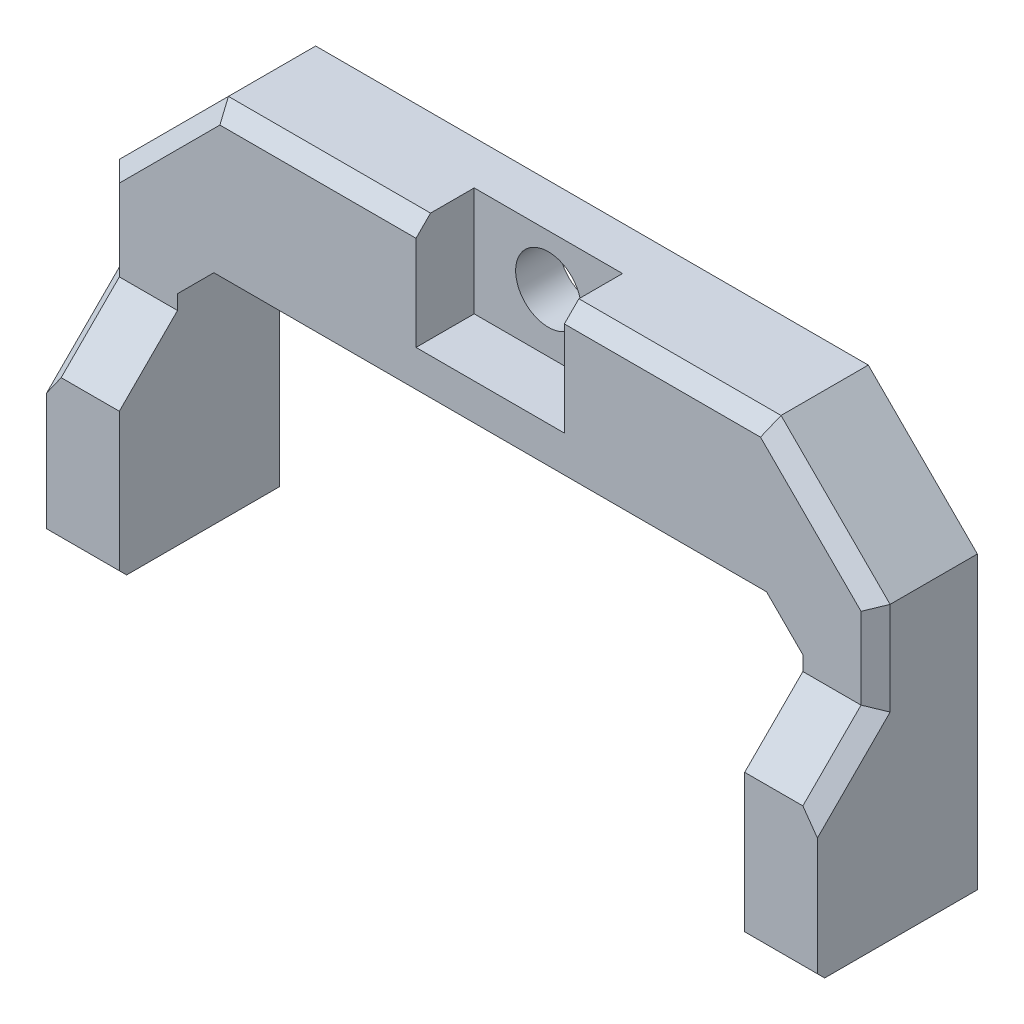
ISO-10303-21;
HEADER;
FILE_DESCRIPTION(('STEP AP214'),'2;1');
FILE_NAME('part.step','',(''),(''),'','','');
FILE_SCHEMA(('AUTOMOTIVE_DESIGN { 1 0 10303 214 1 1 1 1 }'));
ENDSEC;
DATA;
#1=APPLICATION_CONTEXT('core data for automotive mechanical design processes');
#2=APPLICATION_PROTOCOL_DEFINITION('international standard','automotive_design',2000,#1);
#3=PRODUCT_CONTEXT('',#1,'mechanical');
#4=PRODUCT('Part','Part','',(#3));
#5=PRODUCT_RELATED_PRODUCT_CATEGORY('part','',(#4));
#6=PRODUCT_DEFINITION_FORMATION('','',#4);
#7=PRODUCT_DEFINITION_CONTEXT('part definition',#1,'design');
#8=PRODUCT_DEFINITION('design','',#6,#7);
#9=PRODUCT_DEFINITION_SHAPE('','',#8);
#10=(LENGTH_UNIT() NAMED_UNIT(*) SI_UNIT(.MILLI.,.METRE.));
#11=(NAMED_UNIT(*) PLANE_ANGLE_UNIT() SI_UNIT($,.RADIAN.));
#12=(NAMED_UNIT(*) SI_UNIT($,.STERADIAN.) SOLID_ANGLE_UNIT());
#13=UNCERTAINTY_MEASURE_WITH_UNIT(LENGTH_MEASURE(1.E-05),#10,'distance_accuracy_value','');
#14=(GEOMETRIC_REPRESENTATION_CONTEXT(3) GLOBAL_UNCERTAINTY_ASSIGNED_CONTEXT((#13)) GLOBAL_UNIT_ASSIGNED_CONTEXT((#10,
#11,#12)) REPRESENTATION_CONTEXT('',''));
#15=CARTESIAN_POINT('',(0.,0.,0.));
#16=DIRECTION('',(0.,0.,1.));
#17=DIRECTION('',(1.,0.,0.));
#18=AXIS2_PLACEMENT_3D('',#15,#16,#17);
#19=CARTESIAN_POINT('',(-19.,0.,7.));
#20=DIRECTION('',(0.,-1.,0.));
#21=DIRECTION('',(0.,0.,-1.));
#22=AXIS2_PLACEMENT_3D('',#19,#20,#21);
#23=PLANE('',#22);
#24=DIRECTION('',(0.,0.,1.));
#25=VECTOR('',#24,1.);
#26=CARTESIAN_POINT('',(5.1,0.,3.));
#27=LINE('',#26,#25);
#28=CARTESIAN_POINT('',(5.1,0.,3.));
#29=VERTEX_POINT('',#28);
#30=CARTESIAN_POINT('',(5.1,0.,6.00000000000001));
#31=VERTEX_POINT('',#30);
#32=EDGE_CURVE('E239',#29,#31,#27,.T.);
#33=ORIENTED_EDGE('',*,*,#32,.T.);
#34=DIRECTION('',(1.,0.,0.));
#35=VECTOR('',#34,1.);
#36=CARTESIAN_POINT('',(19.,0.,6.00000000000001));
#37=LINE('',#36,#35);
#38=CARTESIAN_POINT('',(19.,0.,6.00000000000001));
#39=VERTEX_POINT('',#38);
#40=EDGE_CURVE('E442',#31,#39,#37,.T.);
#41=ORIENTED_EDGE('',*,*,#40,.T.);
#42=DIRECTION('',(0.,0.,-1.));
#43=VECTOR('',#42,1.);
#44=CARTESIAN_POINT('',(19.,0.,7.));
#45=LINE('',#44,#43);
#46=CARTESIAN_POINT('',(19.,0.,0.));
#47=VERTEX_POINT('',#46);
#48=EDGE_CURVE('E273',#39,#47,#45,.T.);
#49=ORIENTED_EDGE('',*,*,#48,.T.);
#50=DIRECTION('',(-1.,0.,0.));
#51=VECTOR('',#50,1.);
#52=CARTESIAN_POINT('',(-19.,0.,0.));
#53=LINE('',#52,#51);
#54=CARTESIAN_POINT('',(-19.,0.,0.));
#55=VERTEX_POINT('',#54);
#56=EDGE_CURVE('E351',#47,#55,#53,.T.);
#57=ORIENTED_EDGE('',*,*,#56,.T.);
#58=DIRECTION('',(0.,0.,-1.));
#59=VECTOR('',#58,1.);
#60=CARTESIAN_POINT('',(-19.,0.,7.));
#61=LINE('',#60,#59);
#62=CARTESIAN_POINT('',(-19.,0.,5.99999999999999));
#63=VERTEX_POINT('',#62);
#64=EDGE_CURVE('E388',#63,#55,#61,.T.);
#65=ORIENTED_EDGE('',*,*,#64,.F.);
#66=DIRECTION('',(1.,0.,0.));
#67=VECTOR('',#66,1.);
#68=CARTESIAN_POINT('',(-5.1,0.,5.99999999999999));
#69=LINE('',#68,#67);
#70=CARTESIAN_POINT('',(-5.1,0.,5.99999999999999));
#71=VERTEX_POINT('',#70);
#72=EDGE_CURVE('E439',#63,#71,#69,.T.);
#73=ORIENTED_EDGE('',*,*,#72,.T.);
#74=DIRECTION('',(0.,0.,1.));
#75=VECTOR('',#74,1.);
#76=CARTESIAN_POINT('',(-5.1,0.,3.));
#77=LINE('',#76,#75);
#78=CARTESIAN_POINT('',(-5.1,0.,3.));
#79=VERTEX_POINT('',#78);
#80=EDGE_CURVE('E230',#79,#71,#77,.T.);
#81=ORIENTED_EDGE('',*,*,#80,.F.);
#82=DIRECTION('',(-1.,0.,0.));
#83=VECTOR('',#82,1.);
#84=CARTESIAN_POINT('',(0.,0.,3.));
#85=LINE('',#84,#83);
#86=EDGE_CURVE('E311',#29,#79,#85,.T.);
#87=ORIENTED_EDGE('',*,*,#86,.F.);
#88=EDGE_LOOP('',(#33,#41,#49,#57,#65,#73,#81,#87));
#89=FACE_BOUND('',#88,.T.);
#90=ADVANCED_FACE('F40',(#89),#23,.F.);
#91=CARTESIAN_POINT('',(0.,0.,7.));
#92=DIRECTION('',(0.,0.,1.));
#93=DIRECTION('',(1.,0.,0.));
#94=AXIS2_PLACEMENT_3D('',#91,#92,#93);
#95=PLANE('',#94);
#96=DIRECTION('',(1.,0.,0.));
#97=VECTOR('',#96,1.);
#98=CARTESIAN_POINT('',(26.5,-13.5,7.));
#99=LINE('',#98,#97);
#100=CARTESIAN_POINT('',(21.5,-13.5,7.));
#101=VERTEX_POINT('',#100);
#102=CARTESIAN_POINT('',(25.5,-13.5,7.));
#103=VERTEX_POINT('',#102);
#104=EDGE_CURVE('E394',#101,#103,#99,.T.);
#105=ORIENTED_EDGE('',*,*,#104,.T.);
#106=DIRECTION('',(0.,1.,0.));
#107=VECTOR('',#106,1.);
#108=CARTESIAN_POINT('',(25.5,0.,7.));
#109=LINE('',#108,#107);
#110=CARTESIAN_POINT('',(25.5,-7.91421356237307,7.));
#111=VERTEX_POINT('',#110);
#112=EDGE_CURVE('E433',#103,#111,#109,.T.);
#113=ORIENTED_EDGE('',*,*,#112,.T.);
#114=DIRECTION('',(-0.707106781186549,0.707106781186546,0.));
#115=VECTOR('',#114,1.);
#116=CARTESIAN_POINT('',(8.79289321881342,8.79289321881345,7.));
#117=LINE('',#116,#115);
#118=CARTESIAN_POINT('',(18.5857864376269,-0.999999999999994,7.));
#119=VERTEX_POINT('',#118);
#120=EDGE_CURVE('E430',#111,#119,#117,.T.);
#121=ORIENTED_EDGE('',*,*,#120,.T.);
#122=DIRECTION('',(-1.,0.,0.));
#123=VECTOR('',#122,1.);
#124=CARTESIAN_POINT('',(5.1,-0.999999999999994,7.));
#125=LINE('',#124,#123);
#126=CARTESIAN_POINT('',(5.1,-0.999999999999994,7.));
#127=VERTEX_POINT('',#126);
#128=EDGE_CURVE('E427',#119,#127,#125,.T.);
#129=ORIENTED_EDGE('',*,*,#128,.T.);
#130=DIRECTION('',(0.,-1.,0.));
#131=VECTOR('',#130,1.);
#132=CARTESIAN_POINT('',(5.1,0.,7.));
#133=LINE('',#132,#131);
#134=CARTESIAN_POINT('',(5.1,-7.5,7.));
#135=VERTEX_POINT('',#134);
#136=EDGE_CURVE('E241',#127,#135,#133,.T.);
#137=ORIENTED_EDGE('',*,*,#136,.T.);
#138=DIRECTION('',(1.,0.,0.));
#139=VECTOR('',#138,1.);
#140=CARTESIAN_POINT('',(0.,-7.5,7.));
#141=LINE('',#140,#139);
#142=CARTESIAN_POINT('',(-5.1,-7.5,7.));
#143=VERTEX_POINT('',#142);
#144=EDGE_CURVE('E246',#143,#135,#141,.T.);
#145=ORIENTED_EDGE('',*,*,#144,.F.);
#146=DIRECTION('',(0.,-1.,0.));
#147=VECTOR('',#146,1.);
#148=CARTESIAN_POINT('',(-5.1,0.,7.));
#149=LINE('',#148,#147);
#150=CARTESIAN_POINT('',(-5.1,-1.00000000000001,7.));
#151=VERTEX_POINT('',#150);
#152=EDGE_CURVE('E310',#151,#143,#149,.T.);
#153=ORIENTED_EDGE('',*,*,#152,.F.);
#154=DIRECTION('',(-1.,0.,0.));
#155=VECTOR('',#154,1.);
#156=CARTESIAN_POINT('',(-19.,-1.00000000000001,7.));
#157=LINE('',#156,#155);
#158=CARTESIAN_POINT('',(-18.5857864376269,-1.00000000000001,7.));
#159=VERTEX_POINT('',#158);
#160=EDGE_CURVE('E418',#151,#159,#157,.T.);
#161=ORIENTED_EDGE('',*,*,#160,.T.);
#162=DIRECTION('',(-0.707106781186548,-0.707106781186547,0.));
#163=VECTOR('',#162,1.);
#164=CARTESIAN_POINT('',(-25.7928932188134,-8.20710678118654,7.));
#165=LINE('',#164,#163);
#166=CARTESIAN_POINT('',(-25.5,-7.91421356237308,7.));
#167=VERTEX_POINT('',#166);
#168=EDGE_CURVE('E421',#159,#167,#165,.T.);
#169=ORIENTED_EDGE('',*,*,#168,.T.);
#170=DIRECTION('',(0.,-1.,0.));
#171=VECTOR('',#170,1.);
#172=CARTESIAN_POINT('',(-25.5,-13.5,7.));
#173=LINE('',#172,#171);
#174=CARTESIAN_POINT('',(-25.5,-13.5,7.));
#175=VERTEX_POINT('',#174);
#176=EDGE_CURVE('E424',#167,#175,#173,.T.);
#177=ORIENTED_EDGE('',*,*,#176,.T.);
#178=DIRECTION('',(1.,0.,0.));
#179=VECTOR('',#178,1.);
#180=CARTESIAN_POINT('',(0.,-13.5,7.));
#181=LINE('',#180,#179);
#182=CARTESIAN_POINT('',(-21.5,-13.5,7.));
#183=VERTEX_POINT('',#182);
#184=EDGE_CURVE('E391',#175,#183,#181,.T.);
#185=ORIENTED_EDGE('',*,*,#184,.T.);
#186=DIRECTION('',(0.,1.,0.));
#187=VECTOR('',#186,1.);
#188=CARTESIAN_POINT('',(-21.5,-12.5,7.));
#189=LINE('',#188,#187);
#190=CARTESIAN_POINT('',(-21.5,-12.5,7.));
#191=VERTEX_POINT('',#190);
#192=EDGE_CURVE('E341',#183,#191,#189,.T.);
#193=ORIENTED_EDGE('',*,*,#192,.T.);
#194=DIRECTION('',(0.707106781186549,0.707106781186547,0.));
#195=VECTOR('',#194,1.);
#196=CARTESIAN_POINT('',(-19.,-10.,7.));
#197=LINE('',#196,#195);
#198=CARTESIAN_POINT('',(-19.,-10.,7.));
#199=VERTEX_POINT('',#198);
#200=EDGE_CURVE('E345',#191,#199,#197,.T.);
#201=ORIENTED_EDGE('',*,*,#200,.T.);
#202=DIRECTION('',(1.,0.,0.));
#203=VECTOR('',#202,1.);
#204=CARTESIAN_POINT('',(0.,-10.,7.));
#205=LINE('',#204,#203);
#206=CARTESIAN_POINT('',(19.,-10.,7.));
#207=VERTEX_POINT('',#206);
#208=EDGE_CURVE('E338',#199,#207,#205,.T.);
#209=ORIENTED_EDGE('',*,*,#208,.T.);
#210=DIRECTION('',(-0.707106781186549,0.707106781186546,0.));
#211=VECTOR('',#210,1.);
#212=CARTESIAN_POINT('',(19.,-10.,7.));
#213=LINE('',#212,#211);
#214=CARTESIAN_POINT('',(21.5,-12.5,7.));
#215=VERTEX_POINT('',#214);
#216=EDGE_CURVE('E265',#215,#207,#213,.T.);
#217=ORIENTED_EDGE('',*,*,#216,.F.);
#218=DIRECTION('',(0.,1.,0.));
#219=VECTOR('',#218,1.);
#220=CARTESIAN_POINT('',(21.5,-12.5,7.));
#221=LINE('',#220,#219);
#222=EDGE_CURVE('E269',#101,#215,#221,.T.);
#223=ORIENTED_EDGE('',*,*,#222,.F.);
#224=EDGE_LOOP('',(#105,#113,#121,#129,#137,#145,#153,#161,#169,#177,#185,#193,#201,#209,#217,#223));
#225=FACE_BOUND('',#224,.T.);
#226=ADVANCED_FACE('F541',(#225),#95,.T.);
#227=CARTESIAN_POINT('',(0.,-10.,7.));
#228=DIRECTION('',(0.,1.,0.));
#229=DIRECTION('',(-1.,0.,0.));
#230=AXIS2_PLACEMENT_3D('',#227,#228,#229);
#231=PLANE('',#230);
#232=DIRECTION('',(1.,0.,0.));
#233=VECTOR('',#232,1.);
#234=CARTESIAN_POINT('',(0.,-10.,0.));
#235=LINE('',#234,#233);
#236=CARTESIAN_POINT('',(-19.,-10.,0.));
#237=VERTEX_POINT('',#236);
#238=CARTESIAN_POINT('',(19.,-10.,0.));
#239=VERTEX_POINT('',#238);
#240=EDGE_CURVE('E337',#237,#239,#235,.T.);
#241=ORIENTED_EDGE('',*,*,#240,.T.);
#242=DIRECTION('',(0.,0.,-1.));
#243=VECTOR('',#242,1.);
#244=CARTESIAN_POINT('',(19.,-10.,7.));
#245=LINE('',#244,#243);
#246=EDGE_CURVE('E306',#207,#239,#245,.T.);
#247=ORIENTED_EDGE('',*,*,#246,.F.);
#248=ORIENTED_EDGE('',*,*,#208,.F.);
#249=DIRECTION('',(0.,0.,-1.));
#250=VECTOR('',#249,1.);
#251=CARTESIAN_POINT('',(-19.,-10.,7.));
#252=LINE('',#251,#250);
#253=EDGE_CURVE('E348',#199,#237,#252,.T.);
#254=ORIENTED_EDGE('',*,*,#253,.T.);
#255=EDGE_LOOP('',(#241,#247,#248,#254));
#256=FACE_BOUND('',#255,.T.);
#257=ADVANCED_FACE('F547',(#256),#231,.F.);
#258=CARTESIAN_POINT('',(-26.5,-7.49999999999999,7.));
#259=DIRECTION('',(0.707106781186547,-0.707106781186548,0.));
#260=DIRECTION('',(0.707106781186548,0.707106781186547,0.));
#261=AXIS2_PLACEMENT_3D('',#258,#259,#260);
#262=PLANE('',#261);
#263=DIRECTION('',(0.,0.,-1.));
#264=VECTOR('',#263,1.);
#265=CARTESIAN_POINT('',(-26.5,-7.49999999999999,7.));
#266=LINE('',#265,#264);
#267=CARTESIAN_POINT('',(-26.5,-7.49999999999999,5.99999999999999));
#268=VERTEX_POINT('',#267);
#269=CARTESIAN_POINT('',(-26.5,-7.49999999999999,0.));
#270=VERTEX_POINT('',#269);
#271=EDGE_CURVE('E385',#268,#270,#266,.T.);
#272=ORIENTED_EDGE('',*,*,#271,.F.);
#273=DIRECTION('',(0.707106781186548,0.707106781186547,0.));
#274=VECTOR('',#273,1.);
#275=CARTESIAN_POINT('',(-19.,0.,5.99999999999999));
#276=LINE('',#275,#274);
#277=EDGE_CURVE('E461',#268,#63,#276,.T.);
#278=ORIENTED_EDGE('',*,*,#277,.T.);
#279=ORIENTED_EDGE('',*,*,#64,.T.);
#280=DIRECTION('',(-0.707106781186548,-0.707106781186547,0.));
#281=VECTOR('',#280,1.);
#282=CARTESIAN_POINT('',(-26.5,-7.49999999999999,0.));
#283=LINE('',#282,#281);
#284=EDGE_CURVE('E355',#55,#270,#283,.T.);
#285=ORIENTED_EDGE('',*,*,#284,.T.);
#286=EDGE_LOOP('',(#272,#278,#279,#285));
#287=FACE_BOUND('',#286,.T.);
#288=ADVANCED_FACE('F552',(#287),#262,.F.);
#289=CARTESIAN_POINT('',(-26.5,-27.5,7.));
#290=DIRECTION('',(1.,0.,0.));
#291=DIRECTION('',(0.,0.,-1.));
#292=AXIS2_PLACEMENT_3D('',#289,#290,#291);
#293=PLANE('',#292);
#294=DIRECTION('',(0.,0.,-1.));
#295=VECTOR('',#294,1.);
#296=CARTESIAN_POINT('',(-26.5,-27.5,7.));
#297=LINE('',#296,#295);
#298=CARTESIAN_POINT('',(-26.5,-27.5,10.5));
#299=VERTEX_POINT('',#298);
#300=CARTESIAN_POINT('',(-26.5,-27.5,0.));
#301=VERTEX_POINT('',#300);
#302=EDGE_CURVE('E382',#299,#301,#297,.T.);
#303=ORIENTED_EDGE('',*,*,#302,.F.);
#304=DIRECTION('',(0.,-0.707106781186543,-0.707106781186552));
#305=VECTOR('',#304,1.);
#306=CARTESIAN_POINT('',(-26.5,-27.,11.));
#307=LINE('',#306,#305);
#308=CARTESIAN_POINT('',(-26.5,-27.,11.));
#309=VERTEX_POINT('',#308);
#310=EDGE_CURVE('E11',#299,#309,#307,.F.);
#311=ORIENTED_EDGE('',*,*,#310,.T.);
#312=DIRECTION('',(0.,-1.,0.));
#313=VECTOR('',#312,1.);
#314=CARTESIAN_POINT('',(-26.5,-27.5,11.));
#315=LINE('',#314,#313);
#316=CARTESIAN_POINT('',(-26.5,-18.9142135623731,11.));
#317=VERTEX_POINT('',#316);
#318=EDGE_CURVE('E323',#317,#309,#315,.T.);
#319=ORIENTED_EDGE('',*,*,#318,.F.);
#320=DIRECTION('',(0.,0.707106781186547,-0.707106781186548));
#321=VECTOR('',#320,1.);
#322=CARTESIAN_POINT('',(-26.5,-21.2071067811865,13.2928932188134));
#323=LINE('',#322,#321);
#324=CARTESIAN_POINT('',(-26.5,-13.9142135623731,5.99999999999999));
#325=VERTEX_POINT('',#324);
#326=EDGE_CURVE('E451',#317,#325,#323,.T.);
#327=ORIENTED_EDGE('',*,*,#326,.T.);
#328=DIRECTION('',(0.,1.,0.));
#329=VECTOR('',#328,1.);
#330=CARTESIAN_POINT('',(-26.5,-7.49999999999999,5.99999999999999));
#331=LINE('',#330,#329);
#332=EDGE_CURVE('E448',#325,#268,#331,.T.);
#333=ORIENTED_EDGE('',*,*,#332,.T.);
#334=ORIENTED_EDGE('',*,*,#271,.T.);
#335=DIRECTION('',(0.,-1.,0.));
#336=VECTOR('',#335,1.);
#337=CARTESIAN_POINT('',(-26.5,-27.5,0.));
#338=LINE('',#337,#336);
#339=EDGE_CURVE('E359',#270,#301,#338,.T.);
#340=ORIENTED_EDGE('',*,*,#339,.T.);
#341=EDGE_LOOP('',(#303,#311,#319,#327,#333,#334,#340));
#342=FACE_BOUND('',#341,.T.);
#343=ADVANCED_FACE('F532',(#342),#293,.F.);
#344=CARTESIAN_POINT('',(-21.5,-27.5,7.));
#345=DIRECTION('',(0.,1.,0.));
#346=DIRECTION('',(-1.,0.,0.));
#347=AXIS2_PLACEMENT_3D('',#344,#345,#346);
#348=PLANE('',#347);
#349=DIRECTION('',(0.,0.,-1.));
#350=VECTOR('',#349,1.);
#351=CARTESIAN_POINT('',(-21.5,-27.5,7.));
#352=LINE('',#351,#350);
#353=CARTESIAN_POINT('',(-21.5,-27.5,10.5));
#354=VERTEX_POINT('',#353);
#355=CARTESIAN_POINT('',(-21.5,-27.5,0.));
#356=VERTEX_POINT('',#355);
#357=EDGE_CURVE('E379',#354,#356,#352,.T.);
#358=ORIENTED_EDGE('',*,*,#357,.F.);
#359=DIRECTION('',(-1.,0.,0.));
#360=VECTOR('',#359,1.);
#361=CARTESIAN_POINT('',(-21.5,-27.5,10.5));
#362=LINE('',#361,#360);
#363=EDGE_CURVE('E50',#354,#299,#362,.T.);
#364=ORIENTED_EDGE('',*,*,#363,.T.);
#365=ORIENTED_EDGE('',*,*,#302,.T.);
#366=DIRECTION('',(1.,0.,0.));
#367=VECTOR('',#366,1.);
#368=CARTESIAN_POINT('',(-21.5,-27.5,0.));
#369=LINE('',#368,#367);
#370=EDGE_CURVE('E363',#301,#356,#369,.T.);
#371=ORIENTED_EDGE('',*,*,#370,.T.);
#372=EDGE_LOOP('',(#358,#364,#365,#371));
#373=FACE_BOUND('',#372,.T.);
#374=ADVANCED_FACE('F678',(#373),#348,.F.);
#375=CARTESIAN_POINT('',(-21.5,-12.5,7.));
#376=DIRECTION('',(-1.,0.,0.));
#377=DIRECTION('',(0.,-1.,0.));
#378=AXIS2_PLACEMENT_3D('',#375,#376,#377);
#379=PLANE('',#378);
#380=DIRECTION('',(0.,1.,0.));
#381=VECTOR('',#380,1.);
#382=CARTESIAN_POINT('',(-21.5,-27.5,11.));
#383=LINE('',#382,#381);
#384=CARTESIAN_POINT('',(-21.5,-27.,11.));
#385=VERTEX_POINT('',#384);
#386=CARTESIAN_POINT('',(-21.5,-17.5,11.));
#387=VERTEX_POINT('',#386);
#388=EDGE_CURVE('E330',#385,#387,#383,.T.);
#389=ORIENTED_EDGE('',*,*,#388,.F.);
#390=DIRECTION('',(0.,0.707106781186543,0.707106781186552));
#391=VECTOR('',#390,1.);
#392=CARTESIAN_POINT('',(-21.5,-27.,11.));
#393=LINE('',#392,#391);
#394=EDGE_CURVE('E64',#385,#354,#393,.F.);
#395=ORIENTED_EDGE('',*,*,#394,.T.);
#396=ORIENTED_EDGE('',*,*,#357,.T.);
#397=DIRECTION('',(0.,1.,0.));
#398=VECTOR('',#397,1.);
#399=CARTESIAN_POINT('',(-21.5,-12.5,0.));
#400=LINE('',#399,#398);
#401=CARTESIAN_POINT('',(-21.5,-12.5,0.));
#402=VERTEX_POINT('',#401);
#403=EDGE_CURVE('E367',#356,#402,#400,.T.);
#404=ORIENTED_EDGE('',*,*,#403,.T.);
#405=DIRECTION('',(0.,0.,-1.));
#406=VECTOR('',#405,1.);
#407=CARTESIAN_POINT('',(-21.5,-12.5,7.));
#408=LINE('',#407,#406);
#409=EDGE_CURVE('E375',#191,#402,#408,.T.);
#410=ORIENTED_EDGE('',*,*,#409,.F.);
#411=ORIENTED_EDGE('',*,*,#192,.F.);
#412=DIRECTION('',(0.,-0.707106781186547,0.707106781186548));
#413=VECTOR('',#412,1.);
#414=CARTESIAN_POINT('',(-21.5,-13.,6.5));
#415=LINE('',#414,#413);
#416=EDGE_CURVE('E401',#183,#387,#415,.T.);
#417=ORIENTED_EDGE('',*,*,#416,.T.);
#418=EDGE_LOOP('',(#389,#395,#396,#404,#410,#411,#417));
#419=FACE_BOUND('',#418,.T.);
#420=ADVANCED_FACE('F516',(#419),#379,.F.);
#421=CARTESIAN_POINT('',(-19.,-10.,7.));
#422=DIRECTION('',(-0.707106781186546,0.707106781186548,0.));
#423=DIRECTION('',(-0.707106781186549,-0.707106781186547,0.));
#424=AXIS2_PLACEMENT_3D('',#421,#422,#423);
#425=PLANE('',#424);
#426=DIRECTION('',(0.707106781186549,0.707106781186547,0.));
#427=VECTOR('',#426,1.);
#428=CARTESIAN_POINT('',(-19.,-10.,0.));
#429=LINE('',#428,#427);
#430=EDGE_CURVE('E342',#402,#237,#429,.T.);
#431=ORIENTED_EDGE('',*,*,#430,.T.);
#432=ORIENTED_EDGE('',*,*,#253,.F.);
#433=ORIENTED_EDGE('',*,*,#200,.F.);
#434=ORIENTED_EDGE('',*,*,#409,.T.);
#435=EDGE_LOOP('',(#431,#432,#433,#434));
#436=FACE_BOUND('',#435,.T.);
#437=ADVANCED_FACE('F671',(#436),#425,.F.);
#438=CARTESIAN_POINT('',(0.,0.,0.));
#439=DIRECTION('',(0.,0.,1.));
#440=DIRECTION('',(1.,0.,0.));
#441=AXIS2_PLACEMENT_3D('',#438,#439,#440);
#442=PLANE('',#441);
#443=CARTESIAN_POINT('',(0.,-3.5,0.));
#444=DIRECTION('',(0.,0.,1.));
#445=DIRECTION('',(1.,0.,0.));
#446=AXIS2_PLACEMENT_3D('',#443,#444,#445);
#447=CIRCLE('',#446,2.25);
#448=CARTESIAN_POINT('',(2.25,-3.5,0.));
#449=VERTEX_POINT('',#448);
#450=EDGE_CURVE('E641',#449,#449,#447,.T.);
#451=ORIENTED_EDGE('',*,*,#450,.T.);
#452=EDGE_LOOP('',(#451));
#453=FACE_BOUND('',#452,.T.);
#454=ORIENTED_EDGE('',*,*,#240,.F.);
#455=ORIENTED_EDGE('',*,*,#430,.F.);
#456=ORIENTED_EDGE('',*,*,#403,.F.);
#457=ORIENTED_EDGE('',*,*,#370,.F.);
#458=ORIENTED_EDGE('',*,*,#339,.F.);
#459=ORIENTED_EDGE('',*,*,#284,.F.);
#460=ORIENTED_EDGE('',*,*,#56,.F.);
#461=DIRECTION('',(0.707106781186549,-0.707106781186546,0.));
#462=VECTOR('',#461,1.);
#463=CARTESIAN_POINT('',(26.5,-7.49999999999998,0.));
#464=LINE('',#463,#462);
#465=CARTESIAN_POINT('',(26.5,-7.49999999999998,0.));
#466=VERTEX_POINT('',#465);
#467=EDGE_CURVE('E270',#47,#466,#464,.T.);
#468=ORIENTED_EDGE('',*,*,#467,.T.);
#469=DIRECTION('',(0.,-1.,0.));
#470=VECTOR('',#469,1.);
#471=CARTESIAN_POINT('',(26.5,-27.5,0.));
#472=LINE('',#471,#470);
#473=CARTESIAN_POINT('',(26.5,-27.5,0.));
#474=VERTEX_POINT('',#473);
#475=EDGE_CURVE('E285',#466,#474,#472,.T.);
#476=ORIENTED_EDGE('',*,*,#475,.T.);
#477=DIRECTION('',(-1.,0.,0.));
#478=VECTOR('',#477,1.);
#479=CARTESIAN_POINT('',(21.5,-27.5,0.));
#480=LINE('',#479,#478);
#481=CARTESIAN_POINT('',(21.5,-27.5,0.));
#482=VERTEX_POINT('',#481);
#483=EDGE_CURVE('E281',#474,#482,#480,.T.);
#484=ORIENTED_EDGE('',*,*,#483,.T.);
#485=DIRECTION('',(0.,1.,0.));
#486=VECTOR('',#485,1.);
#487=CARTESIAN_POINT('',(21.5,-12.5,0.));
#488=LINE('',#487,#486);
#489=CARTESIAN_POINT('',(21.5,-12.5,0.));
#490=VERTEX_POINT('',#489);
#491=EDGE_CURVE('E277',#482,#490,#488,.T.);
#492=ORIENTED_EDGE('',*,*,#491,.T.);
#493=DIRECTION('',(-0.707106781186549,0.707106781186546,0.));
#494=VECTOR('',#493,1.);
#495=CARTESIAN_POINT('',(19.,-10.,0.));
#496=LINE('',#495,#494);
#497=EDGE_CURVE('E264',#490,#239,#496,.T.);
#498=ORIENTED_EDGE('',*,*,#497,.T.);
#499=EDGE_LOOP('',(#454,#455,#456,#457,#458,#459,#460,#468,#476,#484,#492,#498));
#500=FACE_BOUND('',#499,.T.);
#501=ADVANCED_FACE('F667',(#453,#500),#442,.F.);
#502=CARTESIAN_POINT('',(0.,0.,11.));
#503=DIRECTION('',(0.,0.,-1.));
#504=DIRECTION('',(-1.,0.,0.));
#505=AXIS2_PLACEMENT_3D('',#502,#503,#504);
#506=PLANE('',#505);
#507=ORIENTED_EDGE('',*,*,#318,.T.);
#508=DIRECTION('',(1.,0.,0.));
#509=VECTOR('',#508,1.);
#510=CARTESIAN_POINT('',(0.,-27.,11.));
#511=LINE('',#510,#509);
#512=EDGE_CURVE('E504',#309,#385,#511,.T.);
#513=ORIENTED_EDGE('',*,*,#512,.T.);
#514=ORIENTED_EDGE('',*,*,#388,.T.);
#515=DIRECTION('',(-1.,0.,0.));
#516=VECTOR('',#515,1.);
#517=CARTESIAN_POINT('',(-26.5,-17.5,11.));
#518=LINE('',#517,#516);
#519=CARTESIAN_POINT('',(-25.5,-17.5,11.));
#520=VERTEX_POINT('',#519);
#521=EDGE_CURVE('E333',#387,#520,#518,.T.);
#522=ORIENTED_EDGE('',*,*,#521,.T.);
#523=DIRECTION('',(0.577350269189628,0.816496580927725,0.));
#524=VECTOR('',#523,1.);
#525=CARTESIAN_POINT('',(-27.5808802290397,-20.4428090415821,11.));
#526=LINE('',#525,#524);
#527=EDGE_CURVE('E458',#520,#317,#526,.F.);
#528=ORIENTED_EDGE('',*,*,#527,.T.);
#529=EDGE_LOOP('',(#507,#513,#514,#522,#528));
#530=FACE_BOUND('',#529,.T.);
#531=ADVANCED_FACE('F512',(#530),#506,.F.);
#532=CARTESIAN_POINT('',(0.,-7.5,3.));
#533=DIRECTION('',(0.,-1.,0.));
#534=DIRECTION('',(1.,0.,0.));
#535=AXIS2_PLACEMENT_3D('',#532,#533,#534);
#536=PLANE('',#535);
#537=ORIENTED_EDGE('',*,*,#144,.T.);
#538=DIRECTION('',(0.,0.,1.));
#539=VECTOR('',#538,1.);
#540=CARTESIAN_POINT('',(5.1,-7.5,3.));
#541=LINE('',#540,#539);
#542=CARTESIAN_POINT('',(5.1,-7.5,3.));
#543=VERTEX_POINT('',#542);
#544=EDGE_CURVE('E237',#543,#135,#541,.T.);
#545=ORIENTED_EDGE('',*,*,#544,.F.);
#546=DIRECTION('',(1.,0.,0.));
#547=VECTOR('',#546,1.);
#548=CARTESIAN_POINT('',(0.,-7.5,3.));
#549=LINE('',#548,#547);
#550=CARTESIAN_POINT('',(-5.1,-7.5,3.));
#551=VERTEX_POINT('',#550);
#552=EDGE_CURVE('E220',#551,#543,#549,.T.);
#553=ORIENTED_EDGE('',*,*,#552,.F.);
#554=DIRECTION('',(0.,0.,1.));
#555=VECTOR('',#554,1.);
#556=CARTESIAN_POINT('',(-5.1,-7.5,3.));
#557=LINE('',#556,#555);
#558=EDGE_CURVE('E320',#551,#143,#557,.T.);
#559=ORIENTED_EDGE('',*,*,#558,.T.);
#560=EDGE_LOOP('',(#537,#545,#553,#559));
#561=FACE_BOUND('',#560,.T.);
#562=ADVANCED_FACE('F244',(#561),#536,.F.);
#563=CARTESIAN_POINT('',(-5.1,0.,3.));
#564=DIRECTION('',(-1.,0.,0.));
#565=DIRECTION('',(0.,-1.,0.));
#566=AXIS2_PLACEMENT_3D('',#563,#564,#565);
#567=PLANE('',#566);
#568=ORIENTED_EDGE('',*,*,#80,.T.);
#569=DIRECTION('',(0.,-0.707106781186545,0.70710678118655));
#570=VECTOR('',#569,1.);
#571=CARTESIAN_POINT('',(-5.1,-1.00000000000001,7.));
#572=LINE('',#571,#570);
#573=EDGE_CURVE('E464',#71,#151,#572,.T.);
#574=ORIENTED_EDGE('',*,*,#573,.T.);
#575=ORIENTED_EDGE('',*,*,#152,.T.);
#576=ORIENTED_EDGE('',*,*,#558,.F.);
#577=DIRECTION('',(0.,-1.,0.));
#578=VECTOR('',#577,1.);
#579=CARTESIAN_POINT('',(-5.1,0.,3.));
#580=LINE('',#579,#578);
#581=EDGE_CURVE('E225',#79,#551,#580,.T.);
#582=ORIENTED_EDGE('',*,*,#581,.F.);
#583=EDGE_LOOP('',(#568,#574,#575,#576,#582));
#584=FACE_BOUND('',#583,.T.);
#585=ADVANCED_FACE('F636',(#584),#567,.F.);
#586=CARTESIAN_POINT('',(0.,0.,3.));
#587=DIRECTION('',(0.,0.,-1.));
#588=DIRECTION('',(-1.,0.,0.));
#589=AXIS2_PLACEMENT_3D('',#586,#587,#588);
#590=PLANE('',#589);
#591=CARTESIAN_POINT('',(0.,-3.5,3.));
#592=DIRECTION('',(0.,0.,1.));
#593=DIRECTION('',(1.,0.,0.));
#594=AXIS2_PLACEMENT_3D('',#591,#592,#593);
#595=CIRCLE('',#594,2.24999999999999);
#596=CARTESIAN_POINT('',(2.24999999999999,-3.5,3.));
#597=VERTEX_POINT('',#596);
#598=EDGE_CURVE('E481',#597,#597,#595,.T.);
#599=ORIENTED_EDGE('',*,*,#598,.F.);
#600=EDGE_LOOP('',(#599));
#601=FACE_BOUND('',#600,.T.);
#602=ORIENTED_EDGE('',*,*,#552,.T.);
#603=DIRECTION('',(0.,-1.,0.));
#604=VECTOR('',#603,1.);
#605=CARTESIAN_POINT('',(5.1,0.,3.));
#606=LINE('',#605,#604);
#607=EDGE_CURVE('E224',#29,#543,#606,.T.);
#608=ORIENTED_EDGE('',*,*,#607,.F.);
#609=ORIENTED_EDGE('',*,*,#86,.T.);
#610=ORIENTED_EDGE('',*,*,#581,.T.);
#611=EDGE_LOOP('',(#602,#608,#609,#610));
#612=FACE_BOUND('',#611,.T.);
#613=ADVANCED_FACE('F222',(#601,#612),#590,.F.);
#614=CARTESIAN_POINT('',(19.,-10.,7.));
#615=DIRECTION('',(-0.707106781186546,-0.707106781186549,0.));
#616=DIRECTION('',(0.707106781186549,-0.707106781186546,0.));
#617=AXIS2_PLACEMENT_3D('',#614,#615,#616);
#618=PLANE('',#617);
#619=ORIENTED_EDGE('',*,*,#497,.F.);
#620=DIRECTION('',(0.,0.,-1.));
#621=VECTOR('',#620,1.);
#622=CARTESIAN_POINT('',(21.5,-12.5,7.));
#623=LINE('',#622,#621);
#624=EDGE_CURVE('E303',#215,#490,#623,.T.);
#625=ORIENTED_EDGE('',*,*,#624,.F.);
#626=ORIENTED_EDGE('',*,*,#216,.T.);
#627=ORIENTED_EDGE('',*,*,#246,.T.);
#628=EDGE_LOOP('',(#619,#625,#626,#627));
#629=FACE_BOUND('',#628,.T.);
#630=ADVANCED_FACE('F652',(#629),#618,.T.);
#631=CARTESIAN_POINT('',(21.5,-12.5,7.));
#632=DIRECTION('',(-1.,0.,0.));
#633=DIRECTION('',(0.,-1.,0.));
#634=AXIS2_PLACEMENT_3D('',#631,#632,#633);
#635=PLANE('',#634);
#636=DIRECTION('',(0.,0.,-1.));
#637=VECTOR('',#636,1.);
#638=CARTESIAN_POINT('',(21.5,-27.5,7.));
#639=LINE('',#638,#637);
#640=CARTESIAN_POINT('',(21.5,-27.5,10.5));
#641=VERTEX_POINT('',#640);
#642=EDGE_CURVE('E300',#641,#482,#639,.T.);
#643=ORIENTED_EDGE('',*,*,#642,.F.);
#644=DIRECTION('',(0.,0.707106781186552,0.707106781186543));
#645=VECTOR('',#644,1.);
#646=CARTESIAN_POINT('',(21.5,-21.7499999999999,16.25));
#647=LINE('',#646,#645);
#648=CARTESIAN_POINT('',(21.5,-27.,11.));
#649=VERTEX_POINT('',#648);
#650=EDGE_CURVE('E495',#641,#649,#647,.T.);
#651=ORIENTED_EDGE('',*,*,#650,.T.);
#652=DIRECTION('',(0.,1.,0.));
#653=VECTOR('',#652,1.);
#654=CARTESIAN_POINT('',(21.5,-27.5,11.));
#655=LINE('',#654,#653);
#656=CARTESIAN_POINT('',(21.5,-17.5,11.));
#657=VERTEX_POINT('',#656);
#658=EDGE_CURVE('E261',#649,#657,#655,.T.);
#659=ORIENTED_EDGE('',*,*,#658,.T.);
#660=DIRECTION('',(0.,-0.707106781186547,0.707106781186548));
#661=VECTOR('',#660,1.);
#662=CARTESIAN_POINT('',(21.5,-13.5,7.));
#663=LINE('',#662,#661);
#664=EDGE_CURVE('E398',#657,#101,#663,.F.);
#665=ORIENTED_EDGE('',*,*,#664,.T.);
#666=ORIENTED_EDGE('',*,*,#222,.T.);
#667=ORIENTED_EDGE('',*,*,#624,.T.);
#668=ORIENTED_EDGE('',*,*,#491,.F.);
#669=EDGE_LOOP('',(#643,#651,#659,#665,#666,#667,#668));
#670=FACE_BOUND('',#669,.T.);
#671=ADVANCED_FACE('F658',(#670),#635,.T.);
#672=CARTESIAN_POINT('',(21.5,-27.5,7.));
#673=DIRECTION('',(0.,-1.,0.));
#674=DIRECTION('',(1.,0.,0.));
#675=AXIS2_PLACEMENT_3D('',#672,#673,#674);
#676=PLANE('',#675);
#677=DIRECTION('',(0.,0.,-1.));
#678=VECTOR('',#677,1.);
#679=CARTESIAN_POINT('',(26.5,-27.5,7.));
#680=LINE('',#679,#678);
#681=CARTESIAN_POINT('',(26.5,-27.5,10.5));
#682=VERTEX_POINT('',#681);
#683=EDGE_CURVE('E297',#682,#474,#680,.T.);
#684=ORIENTED_EDGE('',*,*,#683,.F.);
#685=DIRECTION('',(-1.,0.,0.));
#686=VECTOR('',#685,1.);
#687=CARTESIAN_POINT('',(21.5,-27.5,10.5));
#688=LINE('',#687,#686);
#689=EDGE_CURVE('E467',#682,#641,#688,.T.);
#690=ORIENTED_EDGE('',*,*,#689,.T.);
#691=ORIENTED_EDGE('',*,*,#642,.T.);
#692=ORIENTED_EDGE('',*,*,#483,.F.);
#693=EDGE_LOOP('',(#684,#690,#691,#692));
#694=FACE_BOUND('',#693,.T.);
#695=ADVANCED_FACE('F733',(#694),#676,.T.);
#696=CARTESIAN_POINT('',(26.5,-27.5,7.));
#697=DIRECTION('',(1.,0.,0.));
#698=DIRECTION('',(0.,1.,0.));
#699=AXIS2_PLACEMENT_3D('',#696,#697,#698);
#700=PLANE('',#699);
#701=DIRECTION('',(0.,-1.,0.));
#702=VECTOR('',#701,1.);
#703=CARTESIAN_POINT('',(26.5,-27.5,11.));
#704=LINE('',#703,#702);
#705=CARTESIAN_POINT('',(26.5,-18.9142135623731,11.));
#706=VERTEX_POINT('',#705);
#707=CARTESIAN_POINT('',(26.5,-27.,11.));
#708=VERTEX_POINT('',#707);
#709=EDGE_CURVE('E250',#706,#708,#704,.T.);
#710=ORIENTED_EDGE('',*,*,#709,.T.);
#711=DIRECTION('',(0.,-0.707106781186552,-0.707106781186543));
#712=VECTOR('',#711,1.);
#713=CARTESIAN_POINT('',(26.5,-29.25,8.75000000000001));
#714=LINE('',#713,#712);
#715=EDGE_CURVE('E501',#708,#682,#714,.T.);
#716=ORIENTED_EDGE('',*,*,#715,.T.);
#717=ORIENTED_EDGE('',*,*,#683,.T.);
#718=ORIENTED_EDGE('',*,*,#475,.F.);
#719=DIRECTION('',(0.,0.,-1.));
#720=VECTOR('',#719,1.);
#721=CARTESIAN_POINT('',(26.5,-7.49999999999998,7.));
#722=LINE('',#721,#720);
#723=CARTESIAN_POINT('',(26.5,-7.49999999999998,6.00000000000001));
#724=VERTEX_POINT('',#723);
#725=EDGE_CURVE('E294',#724,#466,#722,.T.);
#726=ORIENTED_EDGE('',*,*,#725,.F.);
#727=DIRECTION('',(0.,-1.,0.));
#728=VECTOR('',#727,1.);
#729=CARTESIAN_POINT('',(26.5,-27.5,6.00000000000001));
#730=LINE('',#729,#728);
#731=CARTESIAN_POINT('',(26.5,-13.9142135623731,6.00000000000001));
#732=VERTEX_POINT('',#731);
#733=EDGE_CURVE('E405',#724,#732,#730,.T.);
#734=ORIENTED_EDGE('',*,*,#733,.T.);
#735=DIRECTION('',(0.,-0.707106781186547,0.707106781186548));
#736=VECTOR('',#735,1.);
#737=CARTESIAN_POINT('',(26.5,-18.2071067811865,10.2928932188135));
#738=LINE('',#737,#736);
#739=EDGE_CURVE('E408',#732,#706,#738,.T.);
#740=ORIENTED_EDGE('',*,*,#739,.T.);
#741=EDGE_LOOP('',(#710,#716,#717,#718,#726,#734,#740));
#742=FACE_BOUND('',#741,.T.);
#743=ADVANCED_FACE('F722',(#742),#700,.T.);
#744=CARTESIAN_POINT('',(26.5,-7.49999999999998,7.));
#745=DIRECTION('',(0.707106781186546,0.707106781186549,0.));
#746=DIRECTION('',(-0.707106781186549,0.707106781186546,0.));
#747=AXIS2_PLACEMENT_3D('',#744,#745,#746);
#748=PLANE('',#747);
#749=ORIENTED_EDGE('',*,*,#48,.F.);
#750=DIRECTION('',(0.707106781186549,-0.707106781186546,0.));
#751=VECTOR('',#750,1.);
#752=CARTESIAN_POINT('',(26.5,-7.49999999999998,6.00000000000001));
#753=LINE('',#752,#751);
#754=EDGE_CURVE('E436',#39,#724,#753,.T.);
#755=ORIENTED_EDGE('',*,*,#754,.T.);
#756=ORIENTED_EDGE('',*,*,#725,.T.);
#757=ORIENTED_EDGE('',*,*,#467,.F.);
#758=EDGE_LOOP('',(#749,#755,#756,#757));
#759=FACE_BOUND('',#758,.T.);
#760=ADVANCED_FACE('F743',(#759),#748,.T.);
#761=CARTESIAN_POINT('',(0.,0.,11.));
#762=DIRECTION('',(0.,0.,-1.));
#763=DIRECTION('',(1.,0.,0.));
#764=AXIS2_PLACEMENT_3D('',#761,#762,#763);
#765=PLANE('',#764);
#766=ORIENTED_EDGE('',*,*,#658,.F.);
#767=DIRECTION('',(1.,0.,0.));
#768=VECTOR('',#767,1.);
#769=CARTESIAN_POINT('',(26.5,-27.,11.));
#770=LINE('',#769,#768);
#771=EDGE_CURVE('E498',#649,#708,#770,.T.);
#772=ORIENTED_EDGE('',*,*,#771,.T.);
#773=ORIENTED_EDGE('',*,*,#709,.F.);
#774=DIRECTION('',(0.577350269189626,-0.816496580927726,0.));
#775=VECTOR('',#774,1.);
#776=CARTESIAN_POINT('',(27.5808802290398,-20.442809041582,11.));
#777=LINE('',#776,#775);
#778=CARTESIAN_POINT('',(25.5,-17.5,11.));
#779=VERTEX_POINT('',#778);
#780=EDGE_CURVE('E412',#706,#779,#777,.F.);
#781=ORIENTED_EDGE('',*,*,#780,.T.);
#782=DIRECTION('',(1.,0.,0.));
#783=VECTOR('',#782,1.);
#784=CARTESIAN_POINT('',(26.5,-17.5,11.));
#785=LINE('',#784,#783);
#786=EDGE_CURVE('E257',#657,#779,#785,.T.);
#787=ORIENTED_EDGE('',*,*,#786,.F.);
#788=EDGE_LOOP('',(#766,#772,#773,#781,#787));
#789=FACE_BOUND('',#788,.T.);
#790=ADVANCED_FACE('F726',(#789),#765,.F.);
#791=CARTESIAN_POINT('',(5.1,0.,3.));
#792=DIRECTION('',(-1.,0.,0.));
#793=DIRECTION('',(0.,-1.,0.));
#794=AXIS2_PLACEMENT_3D('',#791,#792,#793);
#795=PLANE('',#794);
#796=ORIENTED_EDGE('',*,*,#136,.F.);
#797=DIRECTION('',(0.,0.707106781186548,-0.707106781186548));
#798=VECTOR('',#797,1.);
#799=CARTESIAN_POINT('',(5.1,1.5,4.5));
#800=LINE('',#799,#798);
#801=EDGE_CURVE('E445',#127,#31,#800,.T.);
#802=ORIENTED_EDGE('',*,*,#801,.T.);
#803=ORIENTED_EDGE('',*,*,#32,.F.);
#804=ORIENTED_EDGE('',*,*,#607,.T.);
#805=ORIENTED_EDGE('',*,*,#544,.T.);
#806=EDGE_LOOP('',(#796,#802,#803,#804,#805));
#807=FACE_BOUND('',#806,.T.);
#808=ADVANCED_FACE('F236',(#807),#795,.T.);
#809=CARTESIAN_POINT('',(0.,-3.5,3.));
#810=DIRECTION('',(0.,0.,1.));
#811=DIRECTION('',(1.,0.,0.));
#812=AXIS2_PLACEMENT_3D('',#809,#810,#811);
#813=CYLINDRICAL_SURFACE('',#812,2.24999999999999);
#814=ORIENTED_EDGE('',*,*,#450,.F.);
#815=EDGE_LOOP('',(#814));
#816=FACE_BOUND('',#815,.T.);
#817=ORIENTED_EDGE('',*,*,#598,.T.);
#818=EDGE_LOOP('',(#817));
#819=FACE_BOUND('',#818,.T.);
#820=ADVANCED_FACE('F564',(#816,#819),#813,.F.);
#821=CARTESIAN_POINT('',(0.,-13.5,7.));
#822=DIRECTION('',(0.,0.707106781186548,0.707106781186547));
#823=DIRECTION('',(-1.,0.,0.));
#824=AXIS2_PLACEMENT_3D('',#821,#822,#823);
#825=PLANE('',#824);
#826=ORIENTED_EDGE('',*,*,#786,.T.);
#827=DIRECTION('',(0.,-0.707106781186547,0.707106781186548));
#828=VECTOR('',#827,1.);
#829=CARTESIAN_POINT('',(25.5,-13.5,7.));
#830=LINE('',#829,#828);
#831=EDGE_CURVE('E415',#779,#103,#830,.F.);
#832=ORIENTED_EDGE('',*,*,#831,.T.);
#833=ORIENTED_EDGE('',*,*,#104,.F.);
#834=ORIENTED_EDGE('',*,*,#664,.F.);
#835=EDGE_LOOP('',(#826,#832,#833,#834));
#836=FACE_BOUND('',#835,.T.);
#837=ADVANCED_FACE('F558',(#836),#825,.T.);
#838=CARTESIAN_POINT('',(-26.5,-17.5,11.));
#839=DIRECTION('',(0.,-0.707106781186548,-0.707106781186547));
#840=DIRECTION('',(-1.,0.,0.));
#841=AXIS2_PLACEMENT_3D('',#838,#839,#840);
#842=PLANE('',#841);
#843=ORIENTED_EDGE('',*,*,#184,.F.);
#844=DIRECTION('',(0.,-0.707106781186547,0.707106781186548));
#845=VECTOR('',#844,1.);
#846=CARTESIAN_POINT('',(-25.5,-17.5,11.));
#847=LINE('',#846,#845);
#848=EDGE_CURVE('E455',#175,#520,#847,.T.);
#849=ORIENTED_EDGE('',*,*,#848,.T.);
#850=ORIENTED_EDGE('',*,*,#521,.F.);
#851=ORIENTED_EDGE('',*,*,#416,.F.);
#852=EDGE_LOOP('',(#843,#849,#850,#851));
#853=FACE_BOUND('',#852,.T.);
#854=ADVANCED_FACE('F523',(#853),#842,.F.);
#855=CARTESIAN_POINT('',(-19.,0.,6.00000000000001));
#856=DIRECTION('',(0.,0.707106781186547,0.707106781186547));
#857=DIRECTION('',(-1.,0.,0.));
#858=AXIS2_PLACEMENT_3D('',#855,#856,#857);
#859=PLANE('',#858);
#860=ORIENTED_EDGE('',*,*,#801,.F.);
#861=ORIENTED_EDGE('',*,*,#128,.F.);
#862=DIRECTION('',(-0.281084637714818,-0.678598344545848,0.678598344545848));
#863=VECTOR('',#862,1.);
#864=CARTESIAN_POINT('',(15.9976742047477,-7.2482556535607,13.2482556535607));
#865=LINE('',#864,#863);
#866=EDGE_CURVE('E477',#39,#119,#865,.T.);
#867=ORIENTED_EDGE('',*,*,#866,.F.);
#868=ORIENTED_EDGE('',*,*,#40,.F.);
#869=EDGE_LOOP('',(#860,#861,#867,#868));
#870=FACE_BOUND('',#869,.T.);
#871=ADVANCED_FACE('F571',(#870),#859,.T.);
#872=CARTESIAN_POINT('',(26.5,-7.49999999999998,6.00000000000001));
#873=DIRECTION('',(-0.5,-0.500000000000001,-0.707106781186547));
#874=DIRECTION('',(0.707106781186549,-0.707106781186546,0.));
#875=AXIS2_PLACEMENT_3D('',#872,#873,#874);
#876=PLANE('',#875);
#877=ORIENTED_EDGE('',*,*,#866,.T.);
#878=ORIENTED_EDGE('',*,*,#120,.F.);
#879=DIRECTION('',(0.678598344545847,0.281084637714819,-0.678598344545847));
#880=VECTOR('',#879,1.);
#881=CARTESIAN_POINT('',(26.5,-7.49999999999998,6.00000000000001));
#882=LINE('',#881,#880);
#883=EDGE_CURVE('E472',#724,#111,#882,.F.);
#884=ORIENTED_EDGE('',*,*,#883,.F.);
#885=ORIENTED_EDGE('',*,*,#754,.F.);
#886=EDGE_LOOP('',(#877,#878,#884,#885));
#887=FACE_BOUND('',#886,.T.);
#888=ADVANCED_FACE('F588',(#887),#876,.F.);
#889=CARTESIAN_POINT('',(26.5,-27.5,6.00000000000001));
#890=DIRECTION('',(-0.707106781186547,0.,-0.707106781186548));
#891=DIRECTION('',(0.,-1.,0.));
#892=AXIS2_PLACEMENT_3D('',#889,#890,#891);
#893=PLANE('',#892);
#894=ORIENTED_EDGE('',*,*,#883,.T.);
#895=ORIENTED_EDGE('',*,*,#112,.F.);
#896=DIRECTION('',(0.678598344545847,-0.281084637714821,-0.678598344545847));
#897=VECTOR('',#896,1.);
#898=CARTESIAN_POINT('',(24.532726422712,-13.0993421657622,7.967273577288));
#899=LINE('',#898,#897);
#900=EDGE_CURVE('E468',#732,#103,#899,.F.);
#901=ORIENTED_EDGE('',*,*,#900,.F.);
#902=ORIENTED_EDGE('',*,*,#733,.F.);
#903=EDGE_LOOP('',(#894,#895,#901,#902));
#904=FACE_BOUND('',#903,.T.);
#905=ADVANCED_FACE('F581',(#904),#893,.F.);
#906=CARTESIAN_POINT('',(26.5,-21.2071067811865,13.2928932188135));
#907=DIRECTION('',(-0.707106781186548,-0.500000000000001,-0.499999999999999));
#908=DIRECTION('',(0.,-0.707106781186547,0.707106781186548));
#909=AXIS2_PLACEMENT_3D('',#906,#907,#908);
#910=PLANE('',#909);
#911=ORIENTED_EDGE('',*,*,#900,.T.);
#912=ORIENTED_EDGE('',*,*,#831,.F.);
#913=ORIENTED_EDGE('',*,*,#780,.F.);
#914=ORIENTED_EDGE('',*,*,#739,.F.);
#915=EDGE_LOOP('',(#911,#912,#913,#914));
#916=FACE_BOUND('',#915,.T.);
#917=ADVANCED_FACE('F573',(#916),#910,.F.);
#918=CARTESIAN_POINT('',(0.,-1.00000000000001,7.));
#919=DIRECTION('',(0.,0.70710678118655,0.707106781186545));
#920=DIRECTION('',(1.,0.,0.));
#921=AXIS2_PLACEMENT_3D('',#918,#919,#920);
#922=PLANE('',#921);
#923=ORIENTED_EDGE('',*,*,#573,.F.);
#924=ORIENTED_EDGE('',*,*,#72,.F.);
#925=DIRECTION('',(0.28108463771482,-0.678598344545845,0.678598344545849));
#926=VECTOR('',#925,1.);
#927=CARTESIAN_POINT('',(-17.1173499627127,-4.5451192532211,10.5451192532211));
#928=LINE('',#927,#926);
#929=EDGE_CURVE('E473',#159,#63,#928,.F.);
#930=ORIENTED_EDGE('',*,*,#929,.F.);
#931=ORIENTED_EDGE('',*,*,#160,.F.);
#932=EDGE_LOOP('',(#923,#924,#930,#931));
#933=FACE_BOUND('',#932,.T.);
#934=ADVANCED_FACE('F580',(#933),#922,.T.);
#935=CARTESIAN_POINT('',(-8.79289321881342,8.79289321881344,7.));
#936=DIRECTION('',(-0.500000000000001,0.500000000000002,0.707106781186546));
#937=DIRECTION('',(0.707106781186548,0.707106781186547,0.));
#938=AXIS2_PLACEMENT_3D('',#935,#936,#937);
#939=PLANE('',#938);
#940=ORIENTED_EDGE('',*,*,#929,.T.);
#941=ORIENTED_EDGE('',*,*,#277,.F.);
#942=DIRECTION('',(0.678598344545844,-0.281084637714821,0.678598344545849));
#943=VECTOR('',#942,1.);
#944=CARTESIAN_POINT('',(-20.9932221359324,-9.78098207627274,11.5067778640676));
#945=LINE('',#944,#943);
#946=EDGE_CURVE('E485',#167,#268,#945,.F.);
#947=ORIENTED_EDGE('',*,*,#946,.F.);
#948=ORIENTED_EDGE('',*,*,#168,.F.);
#949=EDGE_LOOP('',(#940,#941,#947,#948));
#950=FACE_BOUND('',#949,.T.);
#951=ADVANCED_FACE('F613',(#950),#939,.T.);
#952=CARTESIAN_POINT('',(-25.5,0.,7.));
#953=DIRECTION('',(-0.70710678118655,0.,0.707106781186545));
#954=DIRECTION('',(0.,1.,0.));
#955=AXIS2_PLACEMENT_3D('',#952,#953,#954);
#956=PLANE('',#955);
#957=ORIENTED_EDGE('',*,*,#946,.T.);
#958=ORIENTED_EDGE('',*,*,#332,.F.);
#959=DIRECTION('',(-0.678598344545846,-0.281084637714812,-0.678598344545851));
#960=VECTOR('',#959,1.);
#961=CARTESIAN_POINT('',(-24.5327264227119,-13.0993421657622,7.96727357728806));
#962=LINE('',#961,#960);
#963=EDGE_CURVE('E482',#175,#325,#962,.T.);
#964=ORIENTED_EDGE('',*,*,#963,.F.);
#965=ORIENTED_EDGE('',*,*,#176,.F.);
#966=EDGE_LOOP('',(#957,#958,#964,#965));
#967=FACE_BOUND('',#966,.T.);
#968=ADVANCED_FACE('F607',(#967),#956,.T.);
#969=CARTESIAN_POINT('',(-26.5,-21.2071067811865,13.2928932188134));
#970=DIRECTION('',(0.707106781186546,-0.500000000000001,-0.5));
#971=DIRECTION('',(0.,0.707106781186547,-0.707106781186548));
#972=AXIS2_PLACEMENT_3D('',#969,#970,#971);
#973=PLANE('',#972);
#974=ORIENTED_EDGE('',*,*,#527,.F.);
#975=ORIENTED_EDGE('',*,*,#848,.F.);
#976=ORIENTED_EDGE('',*,*,#963,.T.);
#977=ORIENTED_EDGE('',*,*,#326,.F.);
#978=EDGE_LOOP('',(#974,#975,#976,#977));
#979=FACE_BOUND('',#978,.T.);
#980=ADVANCED_FACE('F528',(#979),#973,.F.);
#981=CARTESIAN_POINT('',(21.5,-27.5,10.5));
#982=DIRECTION('',(0.,-0.707106781186543,0.707106781186552));
#983=DIRECTION('',(1.,0.,0.));
#984=AXIS2_PLACEMENT_3D('',#981,#982,#983);
#985=PLANE('',#984);
#986=ORIENTED_EDGE('',*,*,#715,.F.);
#987=ORIENTED_EDGE('',*,*,#771,.F.);
#988=ORIENTED_EDGE('',*,*,#650,.F.);
#989=ORIENTED_EDGE('',*,*,#689,.F.);
#990=EDGE_LOOP('',(#986,#987,#988,#989));
#991=FACE_BOUND('',#990,.T.);
#992=ADVANCED_FACE('F535',(#991),#985,.T.);
#993=CARTESIAN_POINT('',(0.,-27.,11.));
#994=DIRECTION('',(0.,0.707106781186552,-0.707106781186543));
#995=DIRECTION('',(1.,0.,0.));
#996=AXIS2_PLACEMENT_3D('',#993,#994,#995);
#997=PLANE('',#996);
#998=ORIENTED_EDGE('',*,*,#310,.F.);
#999=ORIENTED_EDGE('',*,*,#363,.F.);
#1000=ORIENTED_EDGE('',*,*,#394,.F.);
#1001=ORIENTED_EDGE('',*,*,#512,.F.);
#1002=EDGE_LOOP('',(#998,#999,#1000,#1001));
#1003=FACE_BOUND('',#1002,.T.);
#1004=ADVANCED_FACE('F43',(#1003),#997,.F.);
#1005=CLOSED_SHELL('',(#90,#226,#257,#288,#343,#374,#420,#437,#501,#531,#562,#585,#613,#630,
#671,#695,#743,#760,#790,#808,#820,#837,#854,#871,#888,#905,#917,#934,#951,#968,#980,#992,#1004));
#1006=MANIFOLD_SOLID_BREP('B2',#1005);
#1007=ADVANCED_BREP_SHAPE_REPRESENTATION('',(#18,#1006),#14);
#1008=SHAPE_DEFINITION_REPRESENTATION(#9,#1007);
ENDSEC;
END-ISO-10303-21;
